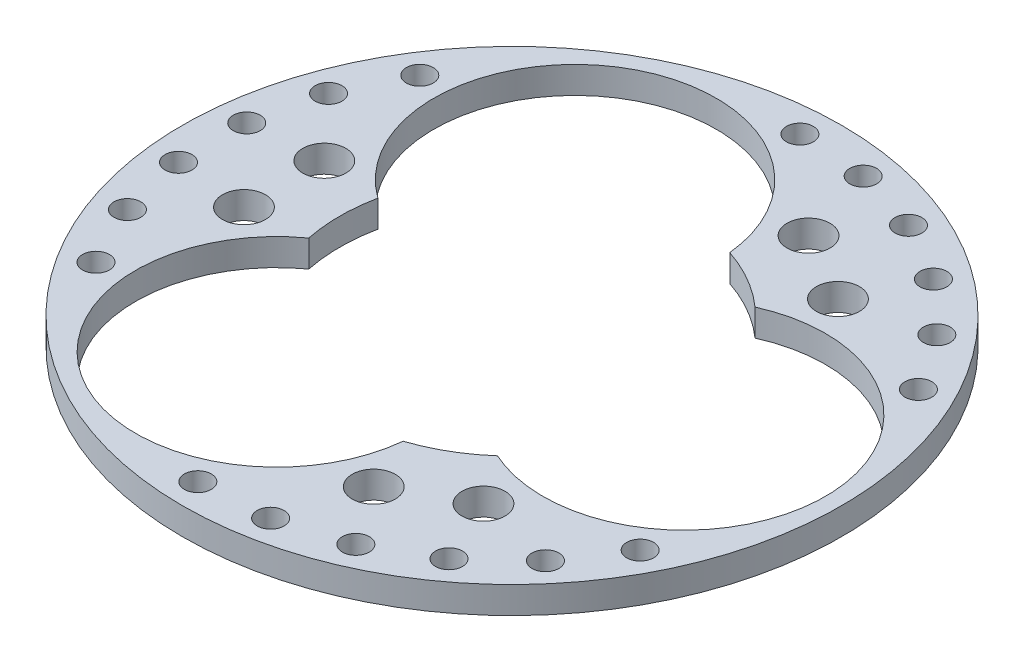
ISO-10303-21;
HEADER;
FILE_DESCRIPTION(('STEP AP214'),'2;1');
FILE_NAME('part.step','',(''),(''),'','','');
FILE_SCHEMA(('AUTOMOTIVE_DESIGN { 1 0 10303 214 1 1 1 1 }'));
ENDSEC;
DATA;
#1=APPLICATION_CONTEXT('core data for automotive mechanical design processes');
#2=APPLICATION_PROTOCOL_DEFINITION('international standard','automotive_design',2000,#1);
#3=PRODUCT_CONTEXT('',#1,'mechanical');
#4=PRODUCT('Part','Part','',(#3));
#5=PRODUCT_RELATED_PRODUCT_CATEGORY('part','',(#4));
#6=PRODUCT_DEFINITION_FORMATION('','',#4);
#7=PRODUCT_DEFINITION_CONTEXT('part definition',#1,'design');
#8=PRODUCT_DEFINITION('design','',#6,#7);
#9=PRODUCT_DEFINITION_SHAPE('','',#8);
#10=(LENGTH_UNIT() NAMED_UNIT(*) SI_UNIT(.MILLI.,.METRE.));
#11=(NAMED_UNIT(*) PLANE_ANGLE_UNIT() SI_UNIT($,.RADIAN.));
#12=(NAMED_UNIT(*) SI_UNIT($,.STERADIAN.) SOLID_ANGLE_UNIT());
#13=UNCERTAINTY_MEASURE_WITH_UNIT(LENGTH_MEASURE(1.E-05),#10,'distance_accuracy_value','');
#14=(GEOMETRIC_REPRESENTATION_CONTEXT(3) GLOBAL_UNCERTAINTY_ASSIGNED_CONTEXT((#13)) GLOBAL_UNIT_ASSIGNED_CONTEXT((#10,
#11,#12)) REPRESENTATION_CONTEXT('',''));
#15=CARTESIAN_POINT('',(0.,0.,0.));
#16=DIRECTION('',(0.,0.,1.));
#17=DIRECTION('',(1.,0.,0.));
#18=AXIS2_PLACEMENT_3D('',#15,#16,#17);
#19=CARTESIAN_POINT('',(0.12997587591132,10.,0.51990350364535));
#20=DIRECTION('',(0.,1.,0.));
#21=DIRECTION('',(0.,0.,1.));
#22=AXIS2_PLACEMENT_3D('',#19,#20,#21);
#23=PLANE('',#22);
#24=CARTESIAN_POINT('',(66.7501279920632,10.,-89.5120648855189));
#25=DIRECTION('',(0.,1.,0.));
#26=DIRECTION('',(0.,0.,1.));
#27=AXIS2_PLACEMENT_3D('',#24,#25,#26);
#28=CIRCLE('',#27,5.00000000000001);
#29=CARTESIAN_POINT('',(66.7501279920632,10.,-84.5120648855189));
#30=VERTEX_POINT('',#29);
#31=EDGE_CURVE('E202',#30,#30,#28,.T.);
#32=ORIENTED_EDGE('',*,*,#31,.F.);
#33=EDGE_LOOP('',(#32));
#34=FACE_BOUND('',#33,.T.);
#35=CARTESIAN_POINT('',(99.4751891918739,10.,-51.1959411787142));
#36=DIRECTION('',(0.,1.,0.));
#37=DIRECTION('',(0.,0.,1.));
#38=AXIS2_PLACEMENT_3D('',#35,#36,#37);
#39=CIRCLE('',#38,5.00000000000001);
#40=CARTESIAN_POINT('',(99.4751891918739,10.,-46.1959411787142));
#41=VERTEX_POINT('',#40);
#42=EDGE_CURVE('E206',#41,#41,#39,.T.);
#43=ORIENTED_EDGE('',*,*,#42,.F.);
#44=EDGE_LOOP('',(#43));
#45=FACE_BOUND('',#44,.T.);
#46=CARTESIAN_POINT('',(29.5437082019155,10.,-80.2936618839527));
#47=DIRECTION('',(0.,1.,0.));
#48=DIRECTION('',(0.,0.,1.));
#49=AXIS2_PLACEMENT_3D('',#46,#47,#48);
#50=CIRCLE('',#49,8.00000000000892);
#51=CARTESIAN_POINT('',(29.5437082019155,10.,-72.2936618839437));
#52=VERTEX_POINT('',#51);
#53=EDGE_CURVE('E210',#52,#52,#50,.T.);
#54=ORIENTED_EDGE('',*,*,#53,.F.);
#55=EDGE_LOOP('',(#54));
#56=FACE_BOUND('',#55,.T.);
#57=CARTESIAN_POINT('',(29.543708201926,10.,81.3334688912253));
#58=DIRECTION('',(0.,1.,0.));
#59=DIRECTION('',(0.,0.,1.));
#60=AXIS2_PLACEMENT_3D('',#57,#58,#59);
#61=CIRCLE('',#60,7.99999999999991);
#62=CARTESIAN_POINT('',(29.543708201926,10.,89.3334688912252));
#63=VERTEX_POINT('',#62);
#64=EDGE_CURVE('E214',#63,#63,#61,.T.);
#65=ORIENTED_EDGE('',*,*,#64,.F.);
#66=EDGE_LOOP('',(#65));
#67=FACE_BOUND('',#66,.T.);
#68=CARTESIAN_POINT('',(99.4751891919042,10.,52.2357481859526));
#69=DIRECTION('',(0.,1.,0.));
#70=DIRECTION('',(0.,0.,1.));
#71=AXIS2_PLACEMENT_3D('',#68,#69,#70);
#72=CIRCLE('',#71,5.00000000000001);
#73=CARTESIAN_POINT('',(99.4751891919042,10.,57.2357481859526));
#74=VERTEX_POINT('',#73);
#75=EDGE_CURVE('E218',#74,#74,#72,.T.);
#76=ORIENTED_EDGE('',*,*,#75,.F.);
#77=EDGE_LOOP('',(#76));
#78=FACE_BOUND('',#77,.T.);
#79=CARTESIAN_POINT('',(66.7501279920936,10.,90.5518718927572));
#80=DIRECTION('',(0.,1.,0.));
#81=DIRECTION('',(0.,0.,1.));
#82=AXIS2_PLACEMENT_3D('',#79,#80,#81);
#83=CIRCLE('',#82,5.00000000000001);
#84=CARTESIAN_POINT('',(66.7501279920936,10.,95.5518718927572));
#85=VERTEX_POINT('',#84);
#86=EDGE_CURVE('E222',#85,#85,#83,.T.);
#87=ORIENTED_EDGE('',*,*,#86,.F.);
#88=EDGE_LOOP('',(#87));
#89=FACE_BOUND('',#88,.T.);
#90=CARTESIAN_POINT('',(20.5403547310638,10.,110.644453150792));
#91=DIRECTION('',(0.,1.,0.));
#92=DIRECTION('',(0.,0.,1.));
#93=AXIS2_PLACEMENT_3D('',#90,#91,#92);
#94=CIRCLE('',#93,5.00000000000001);
#95=CARTESIAN_POINT('',(20.5403547310638,10.,115.644453150792));
#96=VERTEX_POINT('',#95);
#97=EDGE_CURVE('E226',#96,#96,#94,.T.);
#98=ORIENTED_EDGE('',*,*,#97,.F.);
#99=EDGE_LOOP('',(#98));
#100=FACE_BOUND('',#99,.T.);
#101=CARTESIAN_POINT('',(20.5403547310334,10.,-109.604646143553));
#102=DIRECTION('',(0.,1.,0.));
#103=DIRECTION('',(0.,0.,1.));
#104=AXIS2_PLACEMENT_3D('',#101,#102,#103);
#105=CIRCLE('',#104,5.00000000000001);
#106=CARTESIAN_POINT('',(20.5403547310334,10.,-104.604646143553));
#107=VERTEX_POINT('',#106);
#108=EDGE_CURVE('E230',#107,#107,#105,.T.);
#109=ORIENTED_EDGE('',*,*,#108,.F.);
#110=EDGE_LOOP('',(#109));
#111=FACE_BOUND('',#110,.T.);
#112=CARTESIAN_POINT('',(-94.3298660551318,10.,-59.657652631199));
#113=DIRECTION('',(0.,1.,0.));
#114=DIRECTION('',(0.,0.,1.));
#115=AXIS2_PLACEMENT_3D('',#112,#113,#114);
#116=CIRCLE('',#115,5.00000000000001);
#117=CARTESIAN_POINT('',(-94.3298660551318,10.,-54.657652631199));
#118=VERTEX_POINT('',#117);
#119=EDGE_CURVE('E120',#118,#118,#116,.T.);
#120=ORIENTED_EDGE('',*,*,#119,.F.);
#121=EDGE_LOOP('',(#120));
#122=FACE_BOUND('',#121,.T.);
#123=CARTESIAN_POINT('',(-105.445871126413,10.,37.9062717378278));
#124=DIRECTION('',(0.,1.,0.));
#125=DIRECTION('',(0.,0.,1.));
#126=AXIS2_PLACEMENT_3D('',#123,#124,#125);
#127=CIRCLE('',#126,5.00000000000001);
#128=CARTESIAN_POINT('',(-105.445871126413,10.,42.9062717378278));
#129=VERTEX_POINT('',#128);
#130=EDGE_CURVE('E146',#129,#129,#127,.T.);
#131=ORIENTED_EDGE('',*,*,#130,.F.);
#132=EDGE_LOOP('',(#131));
#133=FACE_BOUND('',#132,.T.);
#134=CARTESIAN_POINT('',(-84.5634908831386,10.,-14.4138397757104));
#135=DIRECTION('',(0.,1.,0.));
#136=DIRECTION('',(0.,0.,1.));
#137=AXIS2_PLACEMENT_3D('',#134,#135,#136);
#138=CIRCLE('',#137,8.);
#139=CARTESIAN_POINT('',(-84.5634908831386,10.,-6.41383977571036));
#140=VERTEX_POINT('',#139);
#141=EDGE_CURVE('E158',#140,#140,#138,.T.);
#142=ORIENTED_EDGE('',*,*,#141,.F.);
#143=EDGE_LOOP('',(#142));
#144=FACE_BOUND('',#143,.T.);
#145=CARTESIAN_POINT('',(-105.445871126413,10.,-36.866464730537));
#146=DIRECTION('',(0.,1.,0.));
#147=DIRECTION('',(0.,0.,1.));
#148=AXIS2_PLACEMENT_3D('',#145,#146,#147);
#149=CIRCLE('',#148,5.00000000000001);
#150=CARTESIAN_POINT('',(-105.445871126413,10.,-31.866464730537));
#151=VERTEX_POINT('',#150);
#152=EDGE_CURVE('E170',#151,#151,#149,.T.);
#153=ORIENTED_EDGE('',*,*,#152,.F.);
#154=EDGE_LOOP('',(#153));
#155=FACE_BOUND('',#154,.T.);
#156=CARTESIAN_POINT('',(0.12997587591132,10.,0.51990350364535));
#157=DIRECTION('',(0.,1.,0.));
#158=DIRECTION('',(0.,0.,1.));
#159=AXIS2_PLACEMENT_3D('',#156,#157,#158);
#160=CIRCLE('',#159,122.5);
#161=CARTESIAN_POINT('',(0.12997587591132,10.,123.019903503645));
#162=VERTEX_POINT('',#161);
#163=EDGE_CURVE('E11',#162,#162,#160,.T.);
#164=ORIENTED_EDGE('',*,*,#163,.T.);
#165=EDGE_LOOP('',(#164));
#166=FACE_BOUND('',#165,.T.);
#167=CARTESIAN_POINT('',(-111.150071959866,10.,-12.1588564383602));
#168=DIRECTION('',(0.,1.,0.));
#169=DIRECTION('',(0.,0.,1.));
#170=AXIS2_PLACEMENT_3D('',#167,#168,#169);
#171=CIRCLE('',#170,5.);
#172=CARTESIAN_POINT('',(-111.150071959866,10.,-7.15885643836016));
#173=VERTEX_POINT('',#172);
#174=EDGE_CURVE('E164',#173,#173,#171,.T.);
#175=ORIENTED_EDGE('',*,*,#174,.F.);
#176=EDGE_LOOP('',(#175));
#177=FACE_BOUND('',#176,.T.);
#178=CARTESIAN_POINT('',(-84.5634908831386,10.,15.4536467830012));
#179=DIRECTION('',(0.,1.,0.));
#180=DIRECTION('',(0.,0.,1.));
#181=AXIS2_PLACEMENT_3D('',#178,#179,#180);
#182=CIRCLE('',#181,8.00000000000001);
#183=CARTESIAN_POINT('',(-84.5634908831386,10.,23.4536467830012));
#184=VERTEX_POINT('',#183);
#185=EDGE_CURVE('E152',#184,#184,#182,.T.);
#186=ORIENTED_EDGE('',*,*,#185,.F.);
#187=EDGE_LOOP('',(#186));
#188=FACE_BOUND('',#187,.T.);
#189=CARTESIAN_POINT('',(-111.150071959866,10.,13.198663445651));
#190=DIRECTION('',(0.,1.,0.));
#191=DIRECTION('',(0.,0.,1.));
#192=AXIS2_PLACEMENT_3D('',#189,#190,#191);
#193=CIRCLE('',#192,5.);
#194=CARTESIAN_POINT('',(-111.150071959866,10.,18.198663445651));
#195=VERTEX_POINT('',#194);
#196=EDGE_CURVE('E140',#195,#195,#193,.T.);
#197=ORIENTED_EDGE('',*,*,#196,.F.);
#198=EDGE_LOOP('',(#197));
#199=FACE_BOUND('',#198,.T.);
#200=CARTESIAN_POINT('',(-31.8700241240885,10.,-54.9057223385588));
#201=DIRECTION('',(0.,1.,0.));
#202=DIRECTION('',(0.,0.,1.));
#203=AXIS2_PLACEMENT_3D('',#200,#201,#202);
#204=CIRCLE('',#203,52.5);
#205=CARTESIAN_POINT('',(20.3625679895018,10.,-60.1978222143447));
#206=VERTEX_POINT('',#205);
#207=CARTESIAN_POINT('',(-62.5694131126791,10.,-12.3170206005719));
#208=VERTEX_POINT('',#207);
#209=EDGE_CURVE('E94',#206,#208,#204,.T.);
#210=ORIENTED_EDGE('',*,*,#209,.F.);
#211=CARTESIAN_POINT('',(0.12997587591132,10.,0.51990350364535));
#212=DIRECTION('',(0.,1.,0.));
#213=DIRECTION('',(0.,0.,1.));
#214=AXIS2_PLACEMENT_3D('',#211,#212,#213);
#215=CIRCLE('',#214,64.);
#216=CARTESIAN_POINT('',(42.5967727509113,10.,-47.3608981101277));
#217=VERTEX_POINT('',#216);
#218=EDGE_CURVE('E86',#217,#206,#215,.T.);
#219=ORIENTED_EDGE('',*,*,#218,.F.);
#220=CARTESIAN_POINT('',(64.1299758759113,10.,0.51990350364535));
#221=DIRECTION('',(0.,1.,0.));
#222=DIRECTION('',(0.,0.,1.));
#223=AXIS2_PLACEMENT_3D('',#220,#221,#222);
#224=CIRCLE('',#223,52.5);
#225=CARTESIAN_POINT('',(42.5967727509113,10.,48.4007051174184));
#226=VERTEX_POINT('',#225);
#227=EDGE_CURVE('E117',#226,#217,#224,.T.);
#228=ORIENTED_EDGE('',*,*,#227,.F.);
#229=CARTESIAN_POINT('',(0.12997587591132,10.,0.51990350364535));
#230=DIRECTION('',(0.,1.,0.));
#231=DIRECTION('',(0.,0.,1.));
#232=AXIS2_PLACEMENT_3D('',#229,#230,#231);
#233=CIRCLE('',#232,64.);
#234=CARTESIAN_POINT('',(20.3625679895014,10.,61.2376292216356));
#235=VERTEX_POINT('',#234);
#236=EDGE_CURVE('E115',#235,#226,#233,.T.);
#237=ORIENTED_EDGE('',*,*,#236,.F.);
#238=CARTESIAN_POINT('',(-31.8700241240889,10.,55.9455293458493));
#239=DIRECTION('',(0.,1.,0.));
#240=DIRECTION('',(0.,0.,1.));
#241=AXIS2_PLACEMENT_3D('',#238,#239,#240);
#242=CIRCLE('',#241,52.5);
#243=CARTESIAN_POINT('',(-62.5694131126791,10.,13.3568276078621));
#244=VERTEX_POINT('',#243);
#245=EDGE_CURVE('E110',#244,#235,#242,.T.);
#246=ORIENTED_EDGE('',*,*,#245,.F.);
#247=CARTESIAN_POINT('',(0.12997587591132,10.,0.51990350364535));
#248=DIRECTION('',(0.,1.,0.));
#249=DIRECTION('',(0.,0.,1.));
#250=AXIS2_PLACEMENT_3D('',#247,#248,#249);
#251=CIRCLE('',#250,64.);
#252=EDGE_CURVE('E108',#208,#244,#251,.T.);
#253=ORIENTED_EDGE('',*,*,#252,.F.);
#254=EDGE_LOOP('',(#210,#219,#228,#237,#246,#253));
#255=FACE_BOUND('',#254,.T.);
#256=CARTESIAN_POINT('',(-4.75539550900473,10.,-111.373497313559));
#257=DIRECTION('',(0.,1.,0.));
#258=DIRECTION('',(0.,0.,1.));
#259=AXIS2_PLACEMENT_3D('',#256,#257,#258);
#260=CIRCLE('',#259,5.00000000000001);
#261=CARTESIAN_POINT('',(-4.75539550900473,10.,-106.373497313559));
#262=VERTEX_POINT('',#261);
#263=EDGE_CURVE('E455',#262,#262,#260,.T.);
#264=ORIENTED_EDGE('',*,*,#263,.F.);
#265=EDGE_LOOP('',(#264));
#266=FACE_BOUND('',#265,.T.);
#267=CARTESIAN_POINT('',(-4.75539550897443,10.,112.413304320797));
#268=DIRECTION('',(0.,1.,0.));
#269=DIRECTION('',(0.,0.,1.));
#270=AXIS2_PLACEMENT_3D('',#267,#268,#269);
#271=CIRCLE('',#270,5.00000000000001);
#272=CARTESIAN_POINT('',(-4.75539550897443,10.,117.413304320797));
#273=VERTEX_POINT('',#272);
#274=EDGE_CURVE('E445',#273,#273,#271,.T.);
#275=ORIENTED_EDGE('',*,*,#274,.F.);
#276=EDGE_LOOP('',(#275));
#277=FACE_BOUND('',#276,.T.);
#278=CARTESIAN_POINT('',(44.7898715955709,10.,103.230631834763));
#279=DIRECTION('',(0.,1.,0.));
#280=DIRECTION('',(0.,0.,1.));
#281=AXIS2_PLACEMENT_3D('',#278,#279,#280);
#282=CIRCLE('',#281,5.00000000000001);
#283=CARTESIAN_POINT('',(44.7898715955709,10.,108.230631834763));
#284=VERTEX_POINT('',#283);
#285=EDGE_CURVE('E435',#284,#284,#282,.T.);
#286=ORIENTED_EDGE('',*,*,#285,.F.);
#287=EDGE_LOOP('',(#286));
#288=FACE_BOUND('',#287,.T.);
#289=CARTESIAN_POINT('',(85.2954440231468,10.,73.2580849166094));
#290=DIRECTION('',(0.,1.,0.));
#291=DIRECTION('',(0.,0.,1.));
#292=AXIS2_PLACEMENT_3D('',#289,#290,#291);
#293=CIRCLE('',#292,5.00000000000001);
#294=CARTESIAN_POINT('',(85.2954440231468,10.,78.2580849166094));
#295=VERTEX_POINT('',#294);
#296=EDGE_CURVE('E425',#295,#295,#293,.T.);
#297=ORIENTED_EDGE('',*,*,#296,.F.);
#298=EDGE_LOOP('',(#297));
#299=FACE_BOUND('',#298,.T.);
#300=CARTESIAN_POINT('',(55.4097103089604,10.,66.3997256118695));
#301=DIRECTION('',(0.,1.,0.));
#302=DIRECTION('',(0.,0.,1.));
#303=AXIS2_PLACEMENT_3D('',#300,#301,#302);
#304=CIRCLE('',#303,7.99999999999964);
#305=CARTESIAN_POINT('',(55.4097103089604,10.,74.3997256118692));
#306=VERTEX_POINT('',#305);
#307=EDGE_CURVE('E415',#306,#306,#304,.T.);
#308=ORIENTED_EDGE('',*,*,#307,.F.);
#309=EDGE_LOOP('',(#308));
#310=FACE_BOUND('',#309,.T.);
#311=CARTESIAN_POINT('',(-94.3298660551318,10.,60.6974596384898));
#312=DIRECTION('',(0.,1.,0.));
#313=DIRECTION('',(0.,0.,1.));
#314=AXIS2_PLACEMENT_3D('',#311,#312,#313);
#315=CIRCLE('',#314,5.00000000000001);
#316=CARTESIAN_POINT('',(-94.3298660551318,10.,65.6974596384898));
#317=VERTEX_POINT('',#316);
#318=EDGE_CURVE('E405',#317,#317,#315,.T.);
#319=ORIENTED_EDGE('',*,*,#318,.F.);
#320=EDGE_LOOP('',(#319));
#321=FACE_BOUND('',#320,.T.);
#322=CARTESIAN_POINT('',(55.4097103089499,10.,-65.3599186045969));
#323=DIRECTION('',(0.,1.,0.));
#324=DIRECTION('',(0.,0.,1.));
#325=AXIS2_PLACEMENT_3D('',#322,#323,#324);
#326=CIRCLE('',#325,8.00000000000907);
#327=CARTESIAN_POINT('',(55.4097103089499,10.,-57.3599186045879));
#328=VERTEX_POINT('',#327);
#329=EDGE_CURVE('E395',#328,#328,#326,.T.);
#330=ORIENTED_EDGE('',*,*,#329,.F.);
#331=EDGE_LOOP('',(#330));
#332=FACE_BOUND('',#331,.T.);
#333=CARTESIAN_POINT('',(85.2954440231165,10.,-72.2182779093711));
#334=DIRECTION('',(0.,1.,0.));
#335=DIRECTION('',(0.,0.,1.));
#336=AXIS2_PLACEMENT_3D('',#333,#334,#335);
#337=CIRCLE('',#336,5.00000000000001);
#338=CARTESIAN_POINT('',(85.2954440231165,10.,-67.2182779093711));
#339=VERTEX_POINT('',#338);
#340=EDGE_CURVE('E385',#339,#339,#337,.T.);
#341=ORIENTED_EDGE('',*,*,#340,.F.);
#342=EDGE_LOOP('',(#341));
#343=FACE_BOUND('',#342,.T.);
#344=CARTESIAN_POINT('',(44.7898715955405,10.,-102.190824827524));
#345=DIRECTION('',(0.,1.,0.));
#346=DIRECTION('',(0.,0.,1.));
#347=AXIS2_PLACEMENT_3D('',#344,#345,#346);
#348=CIRCLE('',#347,5.00000000000001);
#349=CARTESIAN_POINT('',(44.7898715955405,10.,-97.1908248275244));
#350=VERTEX_POINT('',#349);
#351=EDGE_CURVE('E372',#350,#350,#348,.T.);
#352=ORIENTED_EDGE('',*,*,#351,.F.);
#353=EDGE_LOOP('',(#352));
#354=FACE_BOUND('',#353,.T.);
#355=ADVANCED_FACE('F33',(#34,#45,#56,#67,#78,#89,#100,#111,#122,#133,#144,#155,#166,#177,#188,
#199,#255,#266,#277,#288,#299,#310,#321,#332,#343,#354),#23,.T.);
#356=CARTESIAN_POINT('',(0.12997587591132,0.,0.51990350364535));
#357=DIRECTION('',(0.,1.,0.));
#358=DIRECTION('',(0.,0.,1.));
#359=AXIS2_PLACEMENT_3D('',#356,#357,#358);
#360=PLANE('',#359);
#361=CARTESIAN_POINT('',(-111.150071959866,0.,13.198663445651));
#362=DIRECTION('',(0.,1.,0.));
#363=DIRECTION('',(0.,0.,1.));
#364=AXIS2_PLACEMENT_3D('',#361,#362,#363);
#365=CIRCLE('',#364,5.);
#366=CARTESIAN_POINT('',(-111.150071959866,0.,18.198663445651));
#367=VERTEX_POINT('',#366);
#368=EDGE_CURVE('E102',#367,#367,#365,.T.);
#369=ORIENTED_EDGE('',*,*,#368,.T.);
#370=EDGE_LOOP('',(#369));
#371=FACE_BOUND('',#370,.T.);
#372=CARTESIAN_POINT('',(-105.445871126413,0.,37.9062717378278));
#373=DIRECTION('',(0.,1.,0.));
#374=DIRECTION('',(0.,0.,1.));
#375=AXIS2_PLACEMENT_3D('',#372,#373,#374);
#376=CIRCLE('',#375,5.00000000000001);
#377=CARTESIAN_POINT('',(-105.445871126413,0.,42.9062717378278));
#378=VERTEX_POINT('',#377);
#379=EDGE_CURVE('E143',#378,#378,#376,.T.);
#380=ORIENTED_EDGE('',*,*,#379,.T.);
#381=EDGE_LOOP('',(#380));
#382=FACE_BOUND('',#381,.T.);
#383=CARTESIAN_POINT('',(-84.5634908831386,0.,15.4536467830012));
#384=DIRECTION('',(0.,1.,0.));
#385=DIRECTION('',(0.,0.,1.));
#386=AXIS2_PLACEMENT_3D('',#383,#384,#385);
#387=CIRCLE('',#386,8.00000000000001);
#388=CARTESIAN_POINT('',(-84.5634908831386,0.,23.4536467830012));
#389=VERTEX_POINT('',#388);
#390=EDGE_CURVE('E149',#389,#389,#387,.T.);
#391=ORIENTED_EDGE('',*,*,#390,.T.);
#392=EDGE_LOOP('',(#391));
#393=FACE_BOUND('',#392,.T.);
#394=CARTESIAN_POINT('',(-84.5634908831386,0.,-14.4138397757104));
#395=DIRECTION('',(0.,1.,0.));
#396=DIRECTION('',(0.,0.,1.));
#397=AXIS2_PLACEMENT_3D('',#394,#395,#396);
#398=CIRCLE('',#397,8.);
#399=CARTESIAN_POINT('',(-84.5634908831386,0.,-6.41383977571036));
#400=VERTEX_POINT('',#399);
#401=EDGE_CURVE('E155',#400,#400,#398,.T.);
#402=ORIENTED_EDGE('',*,*,#401,.T.);
#403=EDGE_LOOP('',(#402));
#404=FACE_BOUND('',#403,.T.);
#405=CARTESIAN_POINT('',(-111.150071959866,0.,-12.1588564383602));
#406=DIRECTION('',(0.,1.,0.));
#407=DIRECTION('',(0.,0.,1.));
#408=AXIS2_PLACEMENT_3D('',#405,#406,#407);
#409=CIRCLE('',#408,5.);
#410=CARTESIAN_POINT('',(-111.150071959866,0.,-7.15885643836016));
#411=VERTEX_POINT('',#410);
#412=EDGE_CURVE('E161',#411,#411,#409,.T.);
#413=ORIENTED_EDGE('',*,*,#412,.T.);
#414=EDGE_LOOP('',(#413));
#415=FACE_BOUND('',#414,.T.);
#416=CARTESIAN_POINT('',(-105.445871126413,0.,-36.866464730537));
#417=DIRECTION('',(0.,1.,0.));
#418=DIRECTION('',(0.,0.,1.));
#419=AXIS2_PLACEMENT_3D('',#416,#417,#418);
#420=CIRCLE('',#419,5.00000000000001);
#421=CARTESIAN_POINT('',(-105.445871126413,0.,-31.866464730537));
#422=VERTEX_POINT('',#421);
#423=EDGE_CURVE('E167',#422,#422,#420,.T.);
#424=ORIENTED_EDGE('',*,*,#423,.T.);
#425=EDGE_LOOP('',(#424));
#426=FACE_BOUND('',#425,.T.);
#427=CARTESIAN_POINT('',(0.12997587591132,0.,0.51990350364535));
#428=DIRECTION('',(0.,1.,0.));
#429=DIRECTION('',(0.,0.,1.));
#430=AXIS2_PLACEMENT_3D('',#427,#428,#429);
#431=CIRCLE('',#430,122.5);
#432=CARTESIAN_POINT('',(0.12997587591132,0.,123.019903503645));
#433=VERTEX_POINT('',#432);
#434=EDGE_CURVE('E37',#433,#433,#431,.T.);
#435=ORIENTED_EDGE('',*,*,#434,.F.);
#436=EDGE_LOOP('',(#435));
#437=FACE_BOUND('',#436,.T.);
#438=CARTESIAN_POINT('',(0.12997587591132,0.,0.51990350364535));
#439=DIRECTION('',(0.,1.,0.));
#440=DIRECTION('',(0.,0.,1.));
#441=AXIS2_PLACEMENT_3D('',#438,#439,#440);
#442=CIRCLE('',#441,64.);
#443=CARTESIAN_POINT('',(42.5967727509113,0.,-47.3608981101277));
#444=VERTEX_POINT('',#443);
#445=CARTESIAN_POINT('',(20.3625679895018,0.,-60.1978222143447));
#446=VERTEX_POINT('',#445);
#447=EDGE_CURVE('E56',#444,#446,#442,.T.);
#448=ORIENTED_EDGE('',*,*,#447,.T.);
#449=CARTESIAN_POINT('',(-31.8700241240885,0.,-54.9057223385588));
#450=DIRECTION('',(0.,1.,0.));
#451=DIRECTION('',(0.,0.,1.));
#452=AXIS2_PLACEMENT_3D('',#449,#450,#451);
#453=CIRCLE('',#452,52.5);
#454=CARTESIAN_POINT('',(-62.5694131126791,0.,-12.3170206005719));
#455=VERTEX_POINT('',#454);
#456=EDGE_CURVE('E101',#446,#455,#453,.T.);
#457=ORIENTED_EDGE('',*,*,#456,.T.);
#458=CARTESIAN_POINT('',(0.12997587591132,0.,0.51990350364535));
#459=DIRECTION('',(0.,1.,0.));
#460=DIRECTION('',(0.,0.,1.));
#461=AXIS2_PLACEMENT_3D('',#458,#459,#460);
#462=CIRCLE('',#461,64.);
#463=CARTESIAN_POINT('',(-62.5694131126791,0.,13.3568276078621));
#464=VERTEX_POINT('',#463);
#465=EDGE_CURVE('E122',#455,#464,#462,.T.);
#466=ORIENTED_EDGE('',*,*,#465,.T.);
#467=CARTESIAN_POINT('',(-31.8700241240889,0.,55.9455293458493));
#468=DIRECTION('',(0.,1.,0.));
#469=DIRECTION('',(0.,0.,1.));
#470=AXIS2_PLACEMENT_3D('',#467,#468,#469);
#471=CIRCLE('',#470,52.5);
#472=CARTESIAN_POINT('',(20.3625679895014,0.,61.2376292216356));
#473=VERTEX_POINT('',#472);
#474=EDGE_CURVE('E125',#464,#473,#471,.T.);
#475=ORIENTED_EDGE('',*,*,#474,.T.);
#476=CARTESIAN_POINT('',(0.12997587591132,0.,0.51990350364535));
#477=DIRECTION('',(0.,1.,0.));
#478=DIRECTION('',(0.,0.,1.));
#479=AXIS2_PLACEMENT_3D('',#476,#477,#478);
#480=CIRCLE('',#479,64.);
#481=CARTESIAN_POINT('',(42.5967727509113,0.,48.4007051174184));
#482=VERTEX_POINT('',#481);
#483=EDGE_CURVE('E128',#473,#482,#480,.T.);
#484=ORIENTED_EDGE('',*,*,#483,.T.);
#485=CARTESIAN_POINT('',(64.1299758759113,0.,0.51990350364535));
#486=DIRECTION('',(0.,1.,0.));
#487=DIRECTION('',(0.,0.,1.));
#488=AXIS2_PLACEMENT_3D('',#485,#486,#487);
#489=CIRCLE('',#488,52.5);
#490=EDGE_CURVE('E95',#482,#444,#489,.T.);
#491=ORIENTED_EDGE('',*,*,#490,.T.);
#492=EDGE_LOOP('',(#448,#457,#466,#475,#484,#491));
#493=FACE_BOUND('',#492,.T.);
#494=CARTESIAN_POINT('',(-94.3298660551318,0.,-59.657652631199));
#495=DIRECTION('',(0.,1.,0.));
#496=DIRECTION('',(0.,0.,1.));
#497=AXIS2_PLACEMENT_3D('',#494,#495,#496);
#498=CIRCLE('',#497,5.00000000000001);
#499=CARTESIAN_POINT('',(-94.3298660551318,0.,-54.657652631199));
#500=VERTEX_POINT('',#499);
#501=EDGE_CURVE('E458',#500,#500,#498,.T.);
#502=ORIENTED_EDGE('',*,*,#501,.T.);
#503=EDGE_LOOP('',(#502));
#504=FACE_BOUND('',#503,.T.);
#505=CARTESIAN_POINT('',(-4.75539550900473,0.,-111.373497313559));
#506=DIRECTION('',(0.,1.,0.));
#507=DIRECTION('',(0.,0.,1.));
#508=AXIS2_PLACEMENT_3D('',#505,#506,#507);
#509=CIRCLE('',#508,5.00000000000001);
#510=CARTESIAN_POINT('',(-4.75539550900473,0.,-106.373497313559));
#511=VERTEX_POINT('',#510);
#512=EDGE_CURVE('E452',#511,#511,#509,.T.);
#513=ORIENTED_EDGE('',*,*,#512,.T.);
#514=EDGE_LOOP('',(#513));
#515=FACE_BOUND('',#514,.T.);
#516=CARTESIAN_POINT('',(20.5403547310334,0.,-109.604646143553));
#517=DIRECTION('',(0.,1.,0.));
#518=DIRECTION('',(0.,0.,1.));
#519=AXIS2_PLACEMENT_3D('',#516,#517,#518);
#520=CIRCLE('',#519,5.00000000000001);
#521=CARTESIAN_POINT('',(20.5403547310334,0.,-104.604646143553));
#522=VERTEX_POINT('',#521);
#523=EDGE_CURVE('E448',#522,#522,#520,.T.);
#524=ORIENTED_EDGE('',*,*,#523,.T.);
#525=EDGE_LOOP('',(#524));
#526=FACE_BOUND('',#525,.T.);
#527=CARTESIAN_POINT('',(-4.75539550897443,0.,112.413304320797));
#528=DIRECTION('',(0.,1.,0.));
#529=DIRECTION('',(0.,0.,1.));
#530=AXIS2_PLACEMENT_3D('',#527,#528,#529);
#531=CIRCLE('',#530,5.00000000000001);
#532=CARTESIAN_POINT('',(-4.75539550897443,0.,117.413304320797));
#533=VERTEX_POINT('',#532);
#534=EDGE_CURVE('E442',#533,#533,#531,.T.);
#535=ORIENTED_EDGE('',*,*,#534,.T.);
#536=EDGE_LOOP('',(#535));
#537=FACE_BOUND('',#536,.T.);
#538=CARTESIAN_POINT('',(20.5403547310638,0.,110.644453150792));
#539=DIRECTION('',(0.,1.,0.));
#540=DIRECTION('',(0.,0.,1.));
#541=AXIS2_PLACEMENT_3D('',#538,#539,#540);
#542=CIRCLE('',#541,5.00000000000001);
#543=CARTESIAN_POINT('',(20.5403547310638,0.,115.644453150792));
#544=VERTEX_POINT('',#543);
#545=EDGE_CURVE('E438',#544,#544,#542,.T.);
#546=ORIENTED_EDGE('',*,*,#545,.T.);
#547=EDGE_LOOP('',(#546));
#548=FACE_BOUND('',#547,.T.);
#549=CARTESIAN_POINT('',(44.7898715955709,0.,103.230631834763));
#550=DIRECTION('',(0.,1.,0.));
#551=DIRECTION('',(0.,0.,1.));
#552=AXIS2_PLACEMENT_3D('',#549,#550,#551);
#553=CIRCLE('',#552,5.00000000000001);
#554=CARTESIAN_POINT('',(44.7898715955709,0.,108.230631834763));
#555=VERTEX_POINT('',#554);
#556=EDGE_CURVE('E432',#555,#555,#553,.T.);
#557=ORIENTED_EDGE('',*,*,#556,.T.);
#558=EDGE_LOOP('',(#557));
#559=FACE_BOUND('',#558,.T.);
#560=CARTESIAN_POINT('',(66.7501279920936,0.,90.5518718927572));
#561=DIRECTION('',(0.,1.,0.));
#562=DIRECTION('',(0.,0.,1.));
#563=AXIS2_PLACEMENT_3D('',#560,#561,#562);
#564=CIRCLE('',#563,5.00000000000001);
#565=CARTESIAN_POINT('',(66.7501279920936,0.,95.5518718927572));
#566=VERTEX_POINT('',#565);
#567=EDGE_CURVE('E428',#566,#566,#564,.T.);
#568=ORIENTED_EDGE('',*,*,#567,.T.);
#569=EDGE_LOOP('',(#568));
#570=FACE_BOUND('',#569,.T.);
#571=CARTESIAN_POINT('',(85.2954440231468,0.,73.2580849166094));
#572=DIRECTION('',(0.,1.,0.));
#573=DIRECTION('',(0.,0.,1.));
#574=AXIS2_PLACEMENT_3D('',#571,#572,#573);
#575=CIRCLE('',#574,5.00000000000001);
#576=CARTESIAN_POINT('',(85.2954440231468,0.,78.2580849166094));
#577=VERTEX_POINT('',#576);
#578=EDGE_CURVE('E422',#577,#577,#575,.T.);
#579=ORIENTED_EDGE('',*,*,#578,.T.);
#580=EDGE_LOOP('',(#579));
#581=FACE_BOUND('',#580,.T.);
#582=CARTESIAN_POINT('',(99.4751891919042,0.,52.2357481859526));
#583=DIRECTION('',(0.,1.,0.));
#584=DIRECTION('',(0.,0.,1.));
#585=AXIS2_PLACEMENT_3D('',#582,#583,#584);
#586=CIRCLE('',#585,5.00000000000001);
#587=CARTESIAN_POINT('',(99.4751891919042,0.,57.2357481859526));
#588=VERTEX_POINT('',#587);
#589=EDGE_CURVE('E418',#588,#588,#586,.T.);
#590=ORIENTED_EDGE('',*,*,#589,.T.);
#591=EDGE_LOOP('',(#590));
#592=FACE_BOUND('',#591,.T.);
#593=CARTESIAN_POINT('',(55.4097103089604,0.,66.3997256118695));
#594=DIRECTION('',(0.,1.,0.));
#595=DIRECTION('',(0.,0.,1.));
#596=AXIS2_PLACEMENT_3D('',#593,#594,#595);
#597=CIRCLE('',#596,7.99999999999964);
#598=CARTESIAN_POINT('',(55.4097103089604,0.,74.3997256118692));
#599=VERTEX_POINT('',#598);
#600=EDGE_CURVE('E412',#599,#599,#597,.T.);
#601=ORIENTED_EDGE('',*,*,#600,.T.);
#602=EDGE_LOOP('',(#601));
#603=FACE_BOUND('',#602,.T.);
#604=CARTESIAN_POINT('',(29.543708201926,0.,81.3334688912253));
#605=DIRECTION('',(0.,1.,0.));
#606=DIRECTION('',(0.,0.,1.));
#607=AXIS2_PLACEMENT_3D('',#604,#605,#606);
#608=CIRCLE('',#607,7.99999999999991);
#609=CARTESIAN_POINT('',(29.543708201926,0.,89.3334688912252));
#610=VERTEX_POINT('',#609);
#611=EDGE_CURVE('E408',#610,#610,#608,.T.);
#612=ORIENTED_EDGE('',*,*,#611,.T.);
#613=EDGE_LOOP('',(#612));
#614=FACE_BOUND('',#613,.T.);
#615=CARTESIAN_POINT('',(-94.3298660551318,0.,60.6974596384898));
#616=DIRECTION('',(0.,1.,0.));
#617=DIRECTION('',(0.,0.,1.));
#618=AXIS2_PLACEMENT_3D('',#615,#616,#617);
#619=CIRCLE('',#618,5.00000000000001);
#620=CARTESIAN_POINT('',(-94.3298660551318,0.,65.6974596384898));
#621=VERTEX_POINT('',#620);
#622=EDGE_CURVE('E402',#621,#621,#619,.T.);
#623=ORIENTED_EDGE('',*,*,#622,.T.);
#624=EDGE_LOOP('',(#623));
#625=FACE_BOUND('',#624,.T.);
#626=CARTESIAN_POINT('',(29.5437082019155,0.,-80.2936618839527));
#627=DIRECTION('',(0.,1.,0.));
#628=DIRECTION('',(0.,0.,1.));
#629=AXIS2_PLACEMENT_3D('',#626,#627,#628);
#630=CIRCLE('',#629,8.00000000000892);
#631=CARTESIAN_POINT('',(29.5437082019155,0.,-72.2936618839437));
#632=VERTEX_POINT('',#631);
#633=EDGE_CURVE('E398',#632,#632,#630,.T.);
#634=ORIENTED_EDGE('',*,*,#633,.T.);
#635=EDGE_LOOP('',(#634));
#636=FACE_BOUND('',#635,.T.);
#637=CARTESIAN_POINT('',(55.4097103089499,0.,-65.3599186045969));
#638=DIRECTION('',(0.,1.,0.));
#639=DIRECTION('',(0.,0.,1.));
#640=AXIS2_PLACEMENT_3D('',#637,#638,#639);
#641=CIRCLE('',#640,8.00000000000907);
#642=CARTESIAN_POINT('',(55.4097103089499,0.,-57.3599186045879));
#643=VERTEX_POINT('',#642);
#644=EDGE_CURVE('E392',#643,#643,#641,.T.);
#645=ORIENTED_EDGE('',*,*,#644,.T.);
#646=EDGE_LOOP('',(#645));
#647=FACE_BOUND('',#646,.T.);
#648=CARTESIAN_POINT('',(99.4751891918739,0.,-51.1959411787142));
#649=DIRECTION('',(0.,1.,0.));
#650=DIRECTION('',(0.,0.,1.));
#651=AXIS2_PLACEMENT_3D('',#648,#649,#650);
#652=CIRCLE('',#651,5.00000000000001);
#653=CARTESIAN_POINT('',(99.4751891918739,0.,-46.1959411787142));
#654=VERTEX_POINT('',#653);
#655=EDGE_CURVE('E388',#654,#654,#652,.T.);
#656=ORIENTED_EDGE('',*,*,#655,.T.);
#657=EDGE_LOOP('',(#656));
#658=FACE_BOUND('',#657,.T.);
#659=CARTESIAN_POINT('',(85.2954440231165,0.,-72.2182779093711));
#660=DIRECTION('',(0.,1.,0.));
#661=DIRECTION('',(0.,0.,1.));
#662=AXIS2_PLACEMENT_3D('',#659,#660,#661);
#663=CIRCLE('',#662,5.00000000000001);
#664=CARTESIAN_POINT('',(85.2954440231165,0.,-67.2182779093711));
#665=VERTEX_POINT('',#664);
#666=EDGE_CURVE('E382',#665,#665,#663,.T.);
#667=ORIENTED_EDGE('',*,*,#666,.T.);
#668=EDGE_LOOP('',(#667));
#669=FACE_BOUND('',#668,.T.);
#670=CARTESIAN_POINT('',(66.7501279920632,0.,-89.5120648855189));
#671=DIRECTION('',(0.,1.,0.));
#672=DIRECTION('',(0.,0.,1.));
#673=AXIS2_PLACEMENT_3D('',#670,#671,#672);
#674=CIRCLE('',#673,5.00000000000001);
#675=CARTESIAN_POINT('',(66.7501279920632,0.,-84.5120648855189));
#676=VERTEX_POINT('',#675);
#677=EDGE_CURVE('E378',#676,#676,#674,.T.);
#678=ORIENTED_EDGE('',*,*,#677,.T.);
#679=EDGE_LOOP('',(#678));
#680=FACE_BOUND('',#679,.T.);
#681=CARTESIAN_POINT('',(44.7898715955405,0.,-102.190824827524));
#682=DIRECTION('',(0.,1.,0.));
#683=DIRECTION('',(0.,0.,1.));
#684=AXIS2_PLACEMENT_3D('',#681,#682,#683);
#685=CIRCLE('',#684,5.00000000000001);
#686=CARTESIAN_POINT('',(44.7898715955405,0.,-97.1908248275244));
#687=VERTEX_POINT('',#686);
#688=EDGE_CURVE('E375',#687,#687,#685,.T.);
#689=ORIENTED_EDGE('',*,*,#688,.T.);
#690=EDGE_LOOP('',(#689));
#691=FACE_BOUND('',#690,.T.);
#692=ADVANCED_FACE('F176',(#371,#382,#393,#404,#415,#426,#437,#493,#504,#515,#526,#537,#548,
#559,#570,#581,#592,#603,#614,#625,#636,#647,#658,#669,#680,#691),#360,.F.);
#693=CARTESIAN_POINT('',(0.12997587591132,10.,0.51990350364535));
#694=DIRECTION('',(0.,-1.,0.));
#695=DIRECTION('',(0.,0.,-1.));
#696=AXIS2_PLACEMENT_3D('',#693,#694,#695);
#697=CYLINDRICAL_SURFACE('',#696,122.5);
#698=ORIENTED_EDGE('',*,*,#163,.F.);
#699=EDGE_LOOP('',(#698));
#700=FACE_BOUND('',#699,.T.);
#701=ORIENTED_EDGE('',*,*,#434,.T.);
#702=EDGE_LOOP('',(#701));
#703=FACE_BOUND('',#702,.T.);
#704=ADVANCED_FACE('F35',(#700,#703),#697,.T.);
#705=CARTESIAN_POINT('',(-105.445871126413,10.,-36.866464730537));
#706=DIRECTION('',(0.,-1.,0.));
#707=DIRECTION('',(0.,0.,-1.));
#708=AXIS2_PLACEMENT_3D('',#705,#706,#707);
#709=CYLINDRICAL_SURFACE('',#708,5.00000000000001);
#710=ORIENTED_EDGE('',*,*,#152,.T.);
#711=EDGE_LOOP('',(#710));
#712=FACE_BOUND('',#711,.T.);
#713=ORIENTED_EDGE('',*,*,#423,.F.);
#714=EDGE_LOOP('',(#713));
#715=FACE_BOUND('',#714,.T.);
#716=ADVANCED_FACE('F179',(#712,#715),#709,.F.);
#717=CARTESIAN_POINT('',(-111.150071959866,10.,-12.1588564383602));
#718=DIRECTION('',(0.,-1.,0.));
#719=DIRECTION('',(0.,0.,-1.));
#720=AXIS2_PLACEMENT_3D('',#717,#718,#719);
#721=CYLINDRICAL_SURFACE('',#720,5.);
#722=ORIENTED_EDGE('',*,*,#174,.T.);
#723=EDGE_LOOP('',(#722));
#724=FACE_BOUND('',#723,.T.);
#725=ORIENTED_EDGE('',*,*,#412,.F.);
#726=EDGE_LOOP('',(#725));
#727=FACE_BOUND('',#726,.T.);
#728=ADVANCED_FACE('F181',(#724,#727),#721,.F.);
#729=CARTESIAN_POINT('',(-84.5634908831386,10.,-14.4138397757104));
#730=DIRECTION('',(0.,-1.,0.));
#731=DIRECTION('',(0.,0.,-1.));
#732=AXIS2_PLACEMENT_3D('',#729,#730,#731);
#733=CYLINDRICAL_SURFACE('',#732,8.);
#734=ORIENTED_EDGE('',*,*,#141,.T.);
#735=EDGE_LOOP('',(#734));
#736=FACE_BOUND('',#735,.T.);
#737=ORIENTED_EDGE('',*,*,#401,.F.);
#738=EDGE_LOOP('',(#737));
#739=FACE_BOUND('',#738,.T.);
#740=ADVANCED_FACE('F188',(#736,#739),#733,.F.);
#741=CARTESIAN_POINT('',(-84.5634908831386,10.,15.4536467830012));
#742=DIRECTION('',(0.,-1.,0.));
#743=DIRECTION('',(0.,0.,-1.));
#744=AXIS2_PLACEMENT_3D('',#741,#742,#743);
#745=CYLINDRICAL_SURFACE('',#744,8.00000000000001);
#746=ORIENTED_EDGE('',*,*,#185,.T.);
#747=EDGE_LOOP('',(#746));
#748=FACE_BOUND('',#747,.T.);
#749=ORIENTED_EDGE('',*,*,#390,.F.);
#750=EDGE_LOOP('',(#749));
#751=FACE_BOUND('',#750,.T.);
#752=ADVANCED_FACE('F265',(#748,#751),#745,.F.);
#753=CARTESIAN_POINT('',(-105.445871126413,10.,37.9062717378278));
#754=DIRECTION('',(0.,-1.,0.));
#755=DIRECTION('',(0.,0.,-1.));
#756=AXIS2_PLACEMENT_3D('',#753,#754,#755);
#757=CYLINDRICAL_SURFACE('',#756,5.00000000000001);
#758=ORIENTED_EDGE('',*,*,#130,.T.);
#759=EDGE_LOOP('',(#758));
#760=FACE_BOUND('',#759,.T.);
#761=ORIENTED_EDGE('',*,*,#379,.F.);
#762=EDGE_LOOP('',(#761));
#763=FACE_BOUND('',#762,.T.);
#764=ADVANCED_FACE('F251',(#760,#763),#757,.F.);
#765=CARTESIAN_POINT('',(-111.150071959866,10.,13.198663445651));
#766=DIRECTION('',(0.,-1.,0.));
#767=DIRECTION('',(0.,0.,-1.));
#768=AXIS2_PLACEMENT_3D('',#765,#766,#767);
#769=CYLINDRICAL_SURFACE('',#768,5.);
#770=ORIENTED_EDGE('',*,*,#196,.T.);
#771=EDGE_LOOP('',(#770));
#772=FACE_BOUND('',#771,.T.);
#773=ORIENTED_EDGE('',*,*,#368,.F.);
#774=EDGE_LOOP('',(#773));
#775=FACE_BOUND('',#774,.T.);
#776=ADVANCED_FACE('F248',(#772,#775),#769,.F.);
#777=CARTESIAN_POINT('',(0.12997587591132,10.,0.51990350364535));
#778=DIRECTION('',(0.,-1.,0.));
#779=DIRECTION('',(0.,0.,-1.));
#780=AXIS2_PLACEMENT_3D('',#777,#778,#779);
#781=CYLINDRICAL_SURFACE('',#780,64.);
#782=ORIENTED_EDGE('',*,*,#447,.F.);
#783=DIRECTION('',(0.,-1.,0.));
#784=VECTOR('',#783,1.);
#785=CARTESIAN_POINT('',(42.5967727509113,10.,-47.3608981101277));
#786=LINE('',#785,#784);
#787=EDGE_CURVE('E90',#217,#444,#786,.T.);
#788=ORIENTED_EDGE('',*,*,#787,.F.);
#789=ORIENTED_EDGE('',*,*,#218,.T.);
#790=DIRECTION('',(0.,-1.,0.));
#791=VECTOR('',#790,1.);
#792=CARTESIAN_POINT('',(20.3625679895018,10.,-60.1978222143447));
#793=LINE('',#792,#791);
#794=EDGE_CURVE('E89',#206,#446,#793,.T.);
#795=ORIENTED_EDGE('',*,*,#794,.T.);
#796=EDGE_LOOP('',(#782,#788,#789,#795));
#797=FACE_BOUND('',#796,.T.);
#798=ADVANCED_FACE('F88',(#797),#781,.F.);
#799=CARTESIAN_POINT('',(-31.8700241240885,10.,-54.9057223385588));
#800=DIRECTION('',(0.,-1.,0.));
#801=DIRECTION('',(0.,0.,-1.));
#802=AXIS2_PLACEMENT_3D('',#799,#800,#801);
#803=CYLINDRICAL_SURFACE('',#802,52.5);
#804=ORIENTED_EDGE('',*,*,#456,.F.);
#805=ORIENTED_EDGE('',*,*,#794,.F.);
#806=ORIENTED_EDGE('',*,*,#209,.T.);
#807=DIRECTION('',(0.,-1.,0.));
#808=VECTOR('',#807,1.);
#809=CARTESIAN_POINT('',(-62.5694131126791,10.,-12.3170206005719));
#810=LINE('',#809,#808);
#811=EDGE_CURVE('E103',#208,#455,#810,.T.);
#812=ORIENTED_EDGE('',*,*,#811,.T.);
#813=EDGE_LOOP('',(#804,#805,#806,#812));
#814=FACE_BOUND('',#813,.T.);
#815=ADVANCED_FACE('F98',(#814),#803,.F.);
#816=CARTESIAN_POINT('',(0.12997587591132,10.,0.51990350364535));
#817=DIRECTION('',(0.,-1.,0.));
#818=DIRECTION('',(0.,0.,-1.));
#819=AXIS2_PLACEMENT_3D('',#816,#817,#818);
#820=CYLINDRICAL_SURFACE('',#819,64.);
#821=ORIENTED_EDGE('',*,*,#465,.F.);
#822=ORIENTED_EDGE('',*,*,#811,.F.);
#823=ORIENTED_EDGE('',*,*,#252,.T.);
#824=DIRECTION('',(0.,-1.,0.));
#825=VECTOR('',#824,1.);
#826=CARTESIAN_POINT('',(-62.5694131126791,10.,13.3568276078621));
#827=LINE('',#826,#825);
#828=EDGE_CURVE('E137',#244,#464,#827,.T.);
#829=ORIENTED_EDGE('',*,*,#828,.T.);
#830=EDGE_LOOP('',(#821,#822,#823,#829));
#831=FACE_BOUND('',#830,.T.);
#832=ADVANCED_FACE('F281',(#831),#820,.F.);
#833=CARTESIAN_POINT('',(-31.8700241240889,10.,55.9455293458493));
#834=DIRECTION('',(0.,-1.,0.));
#835=DIRECTION('',(0.,0.,-1.));
#836=AXIS2_PLACEMENT_3D('',#833,#834,#835);
#837=CYLINDRICAL_SURFACE('',#836,52.5);
#838=ORIENTED_EDGE('',*,*,#474,.F.);
#839=ORIENTED_EDGE('',*,*,#828,.F.);
#840=ORIENTED_EDGE('',*,*,#245,.T.);
#841=DIRECTION('',(0.,-1.,0.));
#842=VECTOR('',#841,1.);
#843=CARTESIAN_POINT('',(20.3625679895014,10.,61.2376292216356));
#844=LINE('',#843,#842);
#845=EDGE_CURVE('E135',#235,#473,#844,.T.);
#846=ORIENTED_EDGE('',*,*,#845,.T.);
#847=EDGE_LOOP('',(#838,#839,#840,#846));
#848=FACE_BOUND('',#847,.T.);
#849=ADVANCED_FACE('F284',(#848),#837,.F.);
#850=CARTESIAN_POINT('',(0.12997587591132,10.,0.51990350364535));
#851=DIRECTION('',(0.,-1.,0.));
#852=DIRECTION('',(0.,0.,-1.));
#853=AXIS2_PLACEMENT_3D('',#850,#851,#852);
#854=CYLINDRICAL_SURFACE('',#853,64.);
#855=ORIENTED_EDGE('',*,*,#483,.F.);
#856=ORIENTED_EDGE('',*,*,#845,.F.);
#857=ORIENTED_EDGE('',*,*,#236,.T.);
#858=DIRECTION('',(0.,-1.,0.));
#859=VECTOR('',#858,1.);
#860=CARTESIAN_POINT('',(42.5967727509113,10.,48.4007051174184));
#861=LINE('',#860,#859);
#862=EDGE_CURVE('E48',#226,#482,#861,.T.);
#863=ORIENTED_EDGE('',*,*,#862,.T.);
#864=EDGE_LOOP('',(#855,#856,#857,#863));
#865=FACE_BOUND('',#864,.T.);
#866=ADVANCED_FACE('F288',(#865),#854,.F.);
#867=CARTESIAN_POINT('',(64.1299758759113,10.,0.51990350364535));
#868=DIRECTION('',(0.,-1.,0.));
#869=DIRECTION('',(0.,0.,-1.));
#870=AXIS2_PLACEMENT_3D('',#867,#868,#869);
#871=CYLINDRICAL_SURFACE('',#870,52.5);
#872=ORIENTED_EDGE('',*,*,#490,.F.);
#873=ORIENTED_EDGE('',*,*,#862,.F.);
#874=ORIENTED_EDGE('',*,*,#227,.T.);
#875=ORIENTED_EDGE('',*,*,#787,.T.);
#876=EDGE_LOOP('',(#872,#873,#874,#875));
#877=FACE_BOUND('',#876,.T.);
#878=ADVANCED_FACE('F292',(#877),#871,.F.);
#879=CARTESIAN_POINT('',(-94.3298660551318,10.,-59.657652631199));
#880=DIRECTION('',(0.,-1.,0.));
#881=DIRECTION('',(0.,0.,-1.));
#882=AXIS2_PLACEMENT_3D('',#879,#880,#881);
#883=CYLINDRICAL_SURFACE('',#882,5.00000000000001);
#884=ORIENTED_EDGE('',*,*,#119,.T.);
#885=EDGE_LOOP('',(#884));
#886=FACE_BOUND('',#885,.T.);
#887=ORIENTED_EDGE('',*,*,#501,.F.);
#888=EDGE_LOOP('',(#887));
#889=FACE_BOUND('',#888,.T.);
#890=ADVANCED_FACE('F296',(#886,#889),#883,.F.);
#891=CARTESIAN_POINT('',(-4.75539550900473,10.,-111.373497313559));
#892=DIRECTION('',(0.,-1.,0.));
#893=DIRECTION('',(0.,0.,-1.));
#894=AXIS2_PLACEMENT_3D('',#891,#892,#893);
#895=CYLINDRICAL_SURFACE('',#894,5.00000000000001);
#896=ORIENTED_EDGE('',*,*,#263,.T.);
#897=EDGE_LOOP('',(#896));
#898=FACE_BOUND('',#897,.T.);
#899=ORIENTED_EDGE('',*,*,#512,.F.);
#900=EDGE_LOOP('',(#899));
#901=FACE_BOUND('',#900,.T.);
#902=ADVANCED_FACE('F299',(#898,#901),#895,.F.);
#903=CARTESIAN_POINT('',(20.5403547310334,10.,-109.604646143553));
#904=DIRECTION('',(0.,-1.,0.));
#905=DIRECTION('',(0.,0.,-1.));
#906=AXIS2_PLACEMENT_3D('',#903,#904,#905);
#907=CYLINDRICAL_SURFACE('',#906,5.00000000000001);
#908=ORIENTED_EDGE('',*,*,#108,.T.);
#909=EDGE_LOOP('',(#908));
#910=FACE_BOUND('',#909,.T.);
#911=ORIENTED_EDGE('',*,*,#523,.F.);
#912=EDGE_LOOP('',(#911));
#913=FACE_BOUND('',#912,.T.);
#914=ADVANCED_FACE('F303',(#910,#913),#907,.F.);
#915=CARTESIAN_POINT('',(-4.75539550897443,10.,112.413304320797));
#916=DIRECTION('',(0.,-1.,0.));
#917=DIRECTION('',(0.,0.,-1.));
#918=AXIS2_PLACEMENT_3D('',#915,#916,#917);
#919=CYLINDRICAL_SURFACE('',#918,5.00000000000001);
#920=ORIENTED_EDGE('',*,*,#274,.T.);
#921=EDGE_LOOP('',(#920));
#922=FACE_BOUND('',#921,.T.);
#923=ORIENTED_EDGE('',*,*,#534,.F.);
#924=EDGE_LOOP('',(#923));
#925=FACE_BOUND('',#924,.T.);
#926=ADVANCED_FACE('F307',(#922,#925),#919,.F.);
#927=CARTESIAN_POINT('',(20.5403547310638,10.,110.644453150792));
#928=DIRECTION('',(0.,-1.,0.));
#929=DIRECTION('',(0.,0.,-1.));
#930=AXIS2_PLACEMENT_3D('',#927,#928,#929);
#931=CYLINDRICAL_SURFACE('',#930,5.00000000000001);
#932=ORIENTED_EDGE('',*,*,#97,.T.);
#933=EDGE_LOOP('',(#932));
#934=FACE_BOUND('',#933,.T.);
#935=ORIENTED_EDGE('',*,*,#545,.F.);
#936=EDGE_LOOP('',(#935));
#937=FACE_BOUND('',#936,.T.);
#938=ADVANCED_FACE('F311',(#934,#937),#931,.F.);
#939=CARTESIAN_POINT('',(44.7898715955709,10.,103.230631834763));
#940=DIRECTION('',(0.,-1.,0.));
#941=DIRECTION('',(0.,0.,-1.));
#942=AXIS2_PLACEMENT_3D('',#939,#940,#941);
#943=CYLINDRICAL_SURFACE('',#942,5.00000000000001);
#944=ORIENTED_EDGE('',*,*,#285,.T.);
#945=EDGE_LOOP('',(#944));
#946=FACE_BOUND('',#945,.T.);
#947=ORIENTED_EDGE('',*,*,#556,.F.);
#948=EDGE_LOOP('',(#947));
#949=FACE_BOUND('',#948,.T.);
#950=ADVANCED_FACE('F315',(#946,#949),#943,.F.);
#951=CARTESIAN_POINT('',(66.7501279920936,10.,90.5518718927572));
#952=DIRECTION('',(0.,-1.,0.));
#953=DIRECTION('',(0.,0.,-1.));
#954=AXIS2_PLACEMENT_3D('',#951,#952,#953);
#955=CYLINDRICAL_SURFACE('',#954,5.00000000000001);
#956=ORIENTED_EDGE('',*,*,#86,.T.);
#957=EDGE_LOOP('',(#956));
#958=FACE_BOUND('',#957,.T.);
#959=ORIENTED_EDGE('',*,*,#567,.F.);
#960=EDGE_LOOP('',(#959));
#961=FACE_BOUND('',#960,.T.);
#962=ADVANCED_FACE('F319',(#958,#961),#955,.F.);
#963=CARTESIAN_POINT('',(85.2954440231468,10.,73.2580849166094));
#964=DIRECTION('',(0.,-1.,0.));
#965=DIRECTION('',(0.,0.,-1.));
#966=AXIS2_PLACEMENT_3D('',#963,#964,#965);
#967=CYLINDRICAL_SURFACE('',#966,5.00000000000001);
#968=ORIENTED_EDGE('',*,*,#296,.T.);
#969=EDGE_LOOP('',(#968));
#970=FACE_BOUND('',#969,.T.);
#971=ORIENTED_EDGE('',*,*,#578,.F.);
#972=EDGE_LOOP('',(#971));
#973=FACE_BOUND('',#972,.T.);
#974=ADVANCED_FACE('F323',(#970,#973),#967,.F.);
#975=CARTESIAN_POINT('',(99.4751891919042,10.,52.2357481859526));
#976=DIRECTION('',(0.,-1.,0.));
#977=DIRECTION('',(0.,0.,-1.));
#978=AXIS2_PLACEMENT_3D('',#975,#976,#977);
#979=CYLINDRICAL_SURFACE('',#978,5.00000000000001);
#980=ORIENTED_EDGE('',*,*,#75,.T.);
#981=EDGE_LOOP('',(#980));
#982=FACE_BOUND('',#981,.T.);
#983=ORIENTED_EDGE('',*,*,#589,.F.);
#984=EDGE_LOOP('',(#983));
#985=FACE_BOUND('',#984,.T.);
#986=ADVANCED_FACE('F327',(#982,#985),#979,.F.);
#987=CARTESIAN_POINT('',(55.4097103089604,10.,66.3997256118695));
#988=DIRECTION('',(0.,-1.,0.));
#989=DIRECTION('',(0.,0.,-1.));
#990=AXIS2_PLACEMENT_3D('',#987,#988,#989);
#991=CYLINDRICAL_SURFACE('',#990,7.99999999999964);
#992=ORIENTED_EDGE('',*,*,#307,.T.);
#993=EDGE_LOOP('',(#992));
#994=FACE_BOUND('',#993,.T.);
#995=ORIENTED_EDGE('',*,*,#600,.F.);
#996=EDGE_LOOP('',(#995));
#997=FACE_BOUND('',#996,.T.);
#998=ADVANCED_FACE('F331',(#994,#997),#991,.F.);
#999=CARTESIAN_POINT('',(29.543708201926,10.,81.3334688912253));
#1000=DIRECTION('',(0.,-1.,0.));
#1001=DIRECTION('',(0.,0.,-1.));
#1002=AXIS2_PLACEMENT_3D('',#999,#1000,#1001);
#1003=CYLINDRICAL_SURFACE('',#1002,7.99999999999991);
#1004=ORIENTED_EDGE('',*,*,#64,.T.);
#1005=EDGE_LOOP('',(#1004));
#1006=FACE_BOUND('',#1005,.T.);
#1007=ORIENTED_EDGE('',*,*,#611,.F.);
#1008=EDGE_LOOP('',(#1007));
#1009=FACE_BOUND('',#1008,.T.);
#1010=ADVANCED_FACE('F335',(#1006,#1009),#1003,.F.);
#1011=CARTESIAN_POINT('',(-94.3298660551318,10.,60.6974596384898));
#1012=DIRECTION('',(0.,-1.,0.));
#1013=DIRECTION('',(0.,0.,-1.));
#1014=AXIS2_PLACEMENT_3D('',#1011,#1012,#1013);
#1015=CYLINDRICAL_SURFACE('',#1014,5.00000000000001);
#1016=ORIENTED_EDGE('',*,*,#318,.T.);
#1017=EDGE_LOOP('',(#1016));
#1018=FACE_BOUND('',#1017,.T.);
#1019=ORIENTED_EDGE('',*,*,#622,.F.);
#1020=EDGE_LOOP('',(#1019));
#1021=FACE_BOUND('',#1020,.T.);
#1022=ADVANCED_FACE('F339',(#1018,#1021),#1015,.F.);
#1023=CARTESIAN_POINT('',(29.5437082019155,10.,-80.2936618839527));
#1024=DIRECTION('',(0.,-1.,0.));
#1025=DIRECTION('',(0.,0.,-1.));
#1026=AXIS2_PLACEMENT_3D('',#1023,#1024,#1025);
#1027=CYLINDRICAL_SURFACE('',#1026,8.00000000000892);
#1028=ORIENTED_EDGE('',*,*,#53,.T.);
#1029=EDGE_LOOP('',(#1028));
#1030=FACE_BOUND('',#1029,.T.);
#1031=ORIENTED_EDGE('',*,*,#633,.F.);
#1032=EDGE_LOOP('',(#1031));
#1033=FACE_BOUND('',#1032,.T.);
#1034=ADVANCED_FACE('F343',(#1030,#1033),#1027,.F.);
#1035=CARTESIAN_POINT('',(55.4097103089499,10.,-65.3599186045969));
#1036=DIRECTION('',(0.,-1.,0.));
#1037=DIRECTION('',(0.,0.,-1.));
#1038=AXIS2_PLACEMENT_3D('',#1035,#1036,#1037);
#1039=CYLINDRICAL_SURFACE('',#1038,8.00000000000907);
#1040=ORIENTED_EDGE('',*,*,#329,.T.);
#1041=EDGE_LOOP('',(#1040));
#1042=FACE_BOUND('',#1041,.T.);
#1043=ORIENTED_EDGE('',*,*,#644,.F.);
#1044=EDGE_LOOP('',(#1043));
#1045=FACE_BOUND('',#1044,.T.);
#1046=ADVANCED_FACE('F347',(#1042,#1045),#1039,.F.);
#1047=CARTESIAN_POINT('',(99.4751891918739,10.,-51.1959411787142));
#1048=DIRECTION('',(0.,-1.,0.));
#1049=DIRECTION('',(0.,0.,-1.));
#1050=AXIS2_PLACEMENT_3D('',#1047,#1048,#1049);
#1051=CYLINDRICAL_SURFACE('',#1050,5.00000000000001);
#1052=ORIENTED_EDGE('',*,*,#42,.T.);
#1053=EDGE_LOOP('',(#1052));
#1054=FACE_BOUND('',#1053,.T.);
#1055=ORIENTED_EDGE('',*,*,#655,.F.);
#1056=EDGE_LOOP('',(#1055));
#1057=FACE_BOUND('',#1056,.T.);
#1058=ADVANCED_FACE('F351',(#1054,#1057),#1051,.F.);
#1059=CARTESIAN_POINT('',(85.2954440231165,10.,-72.2182779093711));
#1060=DIRECTION('',(0.,-1.,0.));
#1061=DIRECTION('',(0.,0.,-1.));
#1062=AXIS2_PLACEMENT_3D('',#1059,#1060,#1061);
#1063=CYLINDRICAL_SURFACE('',#1062,5.00000000000001);
#1064=ORIENTED_EDGE('',*,*,#340,.T.);
#1065=EDGE_LOOP('',(#1064));
#1066=FACE_BOUND('',#1065,.T.);
#1067=ORIENTED_EDGE('',*,*,#666,.F.);
#1068=EDGE_LOOP('',(#1067));
#1069=FACE_BOUND('',#1068,.T.);
#1070=ADVANCED_FACE('F355',(#1066,#1069),#1063,.F.);
#1071=CARTESIAN_POINT('',(66.7501279920632,10.,-89.5120648855189));
#1072=DIRECTION('',(0.,-1.,0.));
#1073=DIRECTION('',(0.,0.,-1.));
#1074=AXIS2_PLACEMENT_3D('',#1071,#1072,#1073);
#1075=CYLINDRICAL_SURFACE('',#1074,5.00000000000001);
#1076=ORIENTED_EDGE('',*,*,#31,.T.);
#1077=EDGE_LOOP('',(#1076));
#1078=FACE_BOUND('',#1077,.T.);
#1079=ORIENTED_EDGE('',*,*,#677,.F.);
#1080=EDGE_LOOP('',(#1079));
#1081=FACE_BOUND('',#1080,.T.);
#1082=ADVANCED_FACE('F359',(#1078,#1081),#1075,.F.);
#1083=CARTESIAN_POINT('',(44.7898715955405,10.,-102.190824827524));
#1084=DIRECTION('',(0.,-1.,0.));
#1085=DIRECTION('',(0.,0.,-1.));
#1086=AXIS2_PLACEMENT_3D('',#1083,#1084,#1085);
#1087=CYLINDRICAL_SURFACE('',#1086,5.00000000000001);
#1088=ORIENTED_EDGE('',*,*,#351,.T.);
#1089=EDGE_LOOP('',(#1088));
#1090=FACE_BOUND('',#1089,.T.);
#1091=ORIENTED_EDGE('',*,*,#688,.F.);
#1092=EDGE_LOOP('',(#1091));
#1093=FACE_BOUND('',#1092,.T.);
#1094=ADVANCED_FACE('F363',(#1090,#1093),#1087,.F.);
#1095=CLOSED_SHELL('',(#355,#692,#704,#716,#728,#740,#752,#764,#776,#798,#815,#832,#849,#866,
#878,#890,#902,#914,#926,#938,#950,#962,#974,#986,#998,#1010,#1022,#1034,#1046,#1058,#1070,
#1082,#1094));
#1096=MANIFOLD_SOLID_BREP('B2',#1095);
#1097=ADVANCED_BREP_SHAPE_REPRESENTATION('',(#18,#1096),#14);
#1098=SHAPE_DEFINITION_REPRESENTATION(#9,#1097);
ENDSEC;
END-ISO-10303-21;
